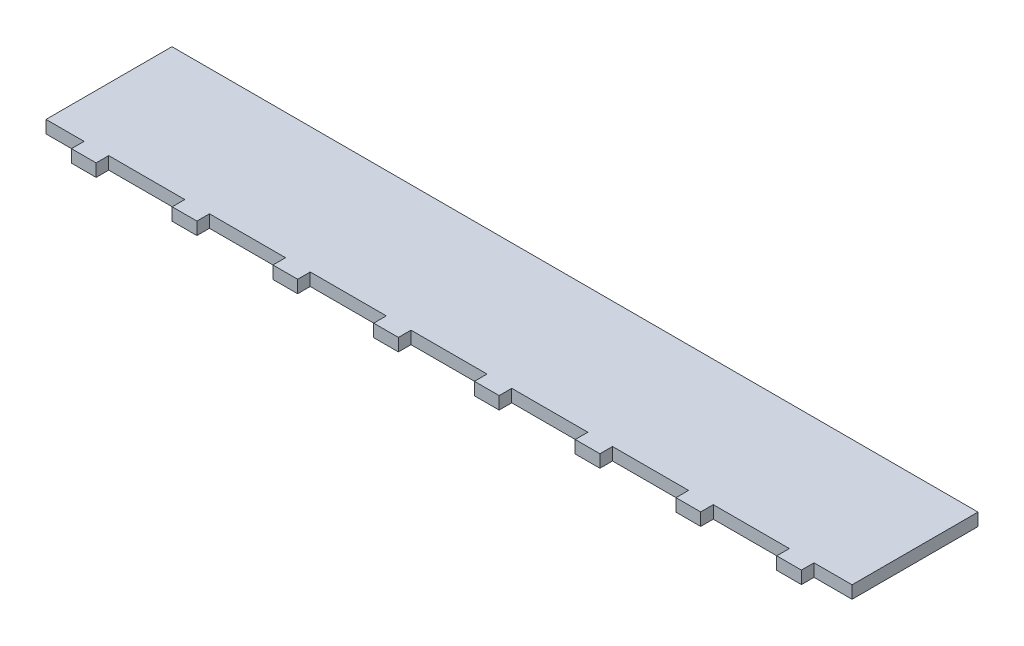
ISO-10303-21;
HEADER;
FILE_DESCRIPTION(('STEP AP214'),'2;1');
FILE_NAME('part.step','',(''),(''),'','','');
FILE_SCHEMA(('AUTOMOTIVE_DESIGN { 1 0 10303 214 1 1 1 1 }'));
ENDSEC;
DATA;
#1=APPLICATION_CONTEXT('core data for automotive mechanical design processes');
#2=APPLICATION_PROTOCOL_DEFINITION('international standard','automotive_design',2000,#1);
#3=PRODUCT_CONTEXT('',#1,'mechanical');
#4=PRODUCT('Part','Part','',(#3));
#5=PRODUCT_RELATED_PRODUCT_CATEGORY('part','',(#4));
#6=PRODUCT_DEFINITION_FORMATION('','',#4);
#7=PRODUCT_DEFINITION_CONTEXT('part definition',#1,'design');
#8=PRODUCT_DEFINITION('design','',#6,#7);
#9=PRODUCT_DEFINITION_SHAPE('','',#8);
#10=(LENGTH_UNIT() NAMED_UNIT(*) SI_UNIT(.MILLI.,.METRE.));
#11=(NAMED_UNIT(*) PLANE_ANGLE_UNIT() SI_UNIT($,.RADIAN.));
#12=(NAMED_UNIT(*) SI_UNIT($,.STERADIAN.) SOLID_ANGLE_UNIT());
#13=UNCERTAINTY_MEASURE_WITH_UNIT(LENGTH_MEASURE(1.E-05),#10,'distance_accuracy_value','');
#14=(GEOMETRIC_REPRESENTATION_CONTEXT(3) GLOBAL_UNCERTAINTY_ASSIGNED_CONTEXT((#13)) GLOBAL_UNIT_ASSIGNED_CONTEXT((#10,
#11,#12)) REPRESENTATION_CONTEXT('',''));
#15=CARTESIAN_POINT('',(0.,0.,0.));
#16=DIRECTION('',(0.,0.,1.));
#17=DIRECTION('',(1.,0.,0.));
#18=AXIS2_PLACEMENT_3D('',#15,#16,#17);
#19=CARTESIAN_POINT('',(-101.6,3.175,15.875));
#20=DIRECTION('',(0.,0.,-1.));
#21=DIRECTION('',(-1.,0.,0.));
#22=AXIS2_PLACEMENT_3D('',#19,#20,#21);
#23=PLANE('',#22);
#24=DIRECTION('',(0.,-1.,0.));
#25=VECTOR('',#24,1.);
#26=CARTESIAN_POINT('',(-92.0114999999999,3.175,15.875));
#27=LINE('',#26,#25);
#28=CARTESIAN_POINT('',(-92.0114999999999,3.175,15.875));
#29=VERTEX_POINT('',#28);
#30=CARTESIAN_POINT('',(-92.0114999999999,0.,15.875));
#31=VERTEX_POINT('',#30);
#32=EDGE_CURVE('E58',#29,#31,#27,.T.);
#33=ORIENTED_EDGE('',*,*,#32,.F.);
#34=DIRECTION('',(1.,0.,0.));
#35=VECTOR('',#34,1.);
#36=CARTESIAN_POINT('',(-101.6,3.175,15.875));
#37=LINE('',#36,#35);
#38=CARTESIAN_POINT('',(-101.6,3.175,15.875));
#39=VERTEX_POINT('',#38);
#40=EDGE_CURVE('E498',#39,#29,#37,.T.);
#41=ORIENTED_EDGE('',*,*,#40,.F.);
#42=DIRECTION('',(0.,-1.,0.));
#43=VECTOR('',#42,1.);
#44=CARTESIAN_POINT('',(-101.6,3.175,15.875));
#45=LINE('',#44,#43);
#46=CARTESIAN_POINT('',(-101.6,0.,15.875));
#47=VERTEX_POINT('',#46);
#48=EDGE_CURVE('E512',#39,#47,#45,.T.);
#49=ORIENTED_EDGE('',*,*,#48,.T.);
#50=DIRECTION('',(1.,0.,0.));
#51=VECTOR('',#50,1.);
#52=CARTESIAN_POINT('',(-101.6,0.,15.875));
#53=LINE('',#52,#51);
#54=EDGE_CURVE('E493',#47,#31,#53,.T.);
#55=ORIENTED_EDGE('',*,*,#54,.T.);
#56=EDGE_LOOP('',(#33,#41,#49,#55));
#57=FACE_BOUND('',#56,.T.);
#58=ADVANCED_FACE('F35',(#57),#23,.F.);
#59=DIRECTION('',(0.,1.,0.));
#60=VECTOR('',#59,1.);
#61=CARTESIAN_POINT('',(-85.7884999999999,3.175,15.875));
#62=LINE('',#61,#60);
#63=CARTESIAN_POINT('',(-85.7884999999999,0.,15.875));
#64=VERTEX_POINT('',#63);
#65=CARTESIAN_POINT('',(-85.7884999999999,3.175,15.875));
#66=VERTEX_POINT('',#65);
#67=EDGE_CURVE('E291',#64,#66,#62,.T.);
#68=ORIENTED_EDGE('',*,*,#67,.F.);
#69=CARTESIAN_POINT('',(-66.6114999999999,0.,15.875));
#70=VERTEX_POINT('',#69);
#71=EDGE_CURVE('E509',#64,#70,#53,.T.);
#72=ORIENTED_EDGE('',*,*,#71,.T.);
#73=DIRECTION('',(0.,-1.,0.));
#74=VECTOR('',#73,1.);
#75=CARTESIAN_POINT('',(-66.6114999999999,3.175,15.875));
#76=LINE('',#75,#74);
#77=CARTESIAN_POINT('',(-66.6114999999999,3.175,15.875));
#78=VERTEX_POINT('',#77);
#79=EDGE_CURVE('E294',#78,#70,#76,.T.);
#80=ORIENTED_EDGE('',*,*,#79,.F.);
#81=EDGE_CURVE('E50',#66,#78,#37,.T.);
#82=ORIENTED_EDGE('',*,*,#81,.F.);
#83=EDGE_LOOP('',(#68,#72,#80,#82));
#84=FACE_BOUND('',#83,.T.);
#85=ADVANCED_FACE('F538',(#84),#23,.F.);
#86=DIRECTION('',(0.,1.,0.));
#87=VECTOR('',#86,1.);
#88=CARTESIAN_POINT('',(-60.3884999999999,3.175,15.875));
#89=LINE('',#88,#87);
#90=CARTESIAN_POINT('',(-60.3884999999999,0.,15.875));
#91=VERTEX_POINT('',#90);
#92=CARTESIAN_POINT('',(-60.3884999999999,3.175,15.875));
#93=VERTEX_POINT('',#92);
#94=EDGE_CURVE('E297',#91,#93,#89,.T.);
#95=ORIENTED_EDGE('',*,*,#94,.F.);
#96=CARTESIAN_POINT('',(-41.2115,0.,15.875));
#97=VERTEX_POINT('',#96);
#98=EDGE_CURVE('E554',#91,#97,#53,.T.);
#99=ORIENTED_EDGE('',*,*,#98,.T.);
#100=DIRECTION('',(0.,-1.,0.));
#101=VECTOR('',#100,1.);
#102=CARTESIAN_POINT('',(-41.2115,3.175,15.875));
#103=LINE('',#102,#101);
#104=CARTESIAN_POINT('',(-41.2115,3.175,15.875));
#105=VERTEX_POINT('',#104);
#106=EDGE_CURVE('E326',#105,#97,#103,.T.);
#107=ORIENTED_EDGE('',*,*,#106,.F.);
#108=EDGE_CURVE('E537',#93,#105,#37,.T.);
#109=ORIENTED_EDGE('',*,*,#108,.F.);
#110=EDGE_LOOP('',(#95,#99,#107,#109));
#111=FACE_BOUND('',#110,.T.);
#112=ADVANCED_FACE('F553',(#111),#23,.F.);
#113=DIRECTION('',(0.,1.,0.));
#114=VECTOR('',#113,1.);
#115=CARTESIAN_POINT('',(-34.9885,3.175,15.875));
#116=LINE('',#115,#114);
#117=CARTESIAN_POINT('',(-34.9885,0.,15.875));
#118=VERTEX_POINT('',#117);
#119=CARTESIAN_POINT('',(-34.9885,3.175,15.875));
#120=VERTEX_POINT('',#119);
#121=EDGE_CURVE('E331',#118,#120,#116,.T.);
#122=ORIENTED_EDGE('',*,*,#121,.F.);
#123=CARTESIAN_POINT('',(-15.8115,0.,15.875));
#124=VERTEX_POINT('',#123);
#125=EDGE_CURVE('E618',#118,#124,#53,.T.);
#126=ORIENTED_EDGE('',*,*,#125,.T.);
#127=DIRECTION('',(0.,-1.,0.));
#128=VECTOR('',#127,1.);
#129=CARTESIAN_POINT('',(-15.8115,3.175,15.875));
#130=LINE('',#129,#128);
#131=CARTESIAN_POINT('',(-15.8115,3.175,15.875));
#132=VERTEX_POINT('',#131);
#133=EDGE_CURVE('E353',#132,#124,#130,.T.);
#134=ORIENTED_EDGE('',*,*,#133,.F.);
#135=EDGE_CURVE('E555',#120,#132,#37,.T.);
#136=ORIENTED_EDGE('',*,*,#135,.F.);
#137=EDGE_LOOP('',(#122,#126,#134,#136));
#138=FACE_BOUND('',#137,.T.);
#139=ADVANCED_FACE('F623',(#138),#23,.F.);
#140=DIRECTION('',(0.,1.,0.));
#141=VECTOR('',#140,1.);
#142=CARTESIAN_POINT('',(-9.58849999999996,3.175,15.875));
#143=LINE('',#142,#141);
#144=CARTESIAN_POINT('',(-9.58849999999996,0.,15.875));
#145=VERTEX_POINT('',#144);
#146=CARTESIAN_POINT('',(-9.58849999999996,3.175,15.875));
#147=VERTEX_POINT('',#146);
#148=EDGE_CURVE('E358',#145,#147,#143,.T.);
#149=ORIENTED_EDGE('',*,*,#148,.F.);
#150=CARTESIAN_POINT('',(9.58850000000005,0.,15.875));
#151=VERTEX_POINT('',#150);
#152=EDGE_CURVE('E615',#145,#151,#53,.T.);
#153=ORIENTED_EDGE('',*,*,#152,.T.);
#154=DIRECTION('',(0.,-1.,0.));
#155=VECTOR('',#154,1.);
#156=CARTESIAN_POINT('',(9.58850000000005,3.175,15.875));
#157=LINE('',#156,#155);
#158=CARTESIAN_POINT('',(9.58850000000005,3.175,15.875));
#159=VERTEX_POINT('',#158);
#160=EDGE_CURVE('E380',#159,#151,#157,.T.);
#161=ORIENTED_EDGE('',*,*,#160,.F.);
#162=EDGE_CURVE('E556',#147,#159,#37,.T.);
#163=ORIENTED_EDGE('',*,*,#162,.F.);
#164=EDGE_LOOP('',(#149,#153,#161,#163));
#165=FACE_BOUND('',#164,.T.);
#166=ADVANCED_FACE('F637',(#165),#23,.F.);
#167=DIRECTION('',(0.,1.,0.));
#168=VECTOR('',#167,1.);
#169=CARTESIAN_POINT('',(15.8115,3.175,15.875));
#170=LINE('',#169,#168);
#171=CARTESIAN_POINT('',(15.8115,0.,15.875));
#172=VERTEX_POINT('',#171);
#173=CARTESIAN_POINT('',(15.8115,3.175,15.875));
#174=VERTEX_POINT('',#173);
#175=EDGE_CURVE('E385',#172,#174,#170,.T.);
#176=ORIENTED_EDGE('',*,*,#175,.F.);
#177=CARTESIAN_POINT('',(34.9885,0.,15.875));
#178=VERTEX_POINT('',#177);
#179=EDGE_CURVE('E613',#172,#178,#53,.T.);
#180=ORIENTED_EDGE('',*,*,#179,.T.);
#181=DIRECTION('',(0.,-1.,0.));
#182=VECTOR('',#181,1.);
#183=CARTESIAN_POINT('',(34.9885,3.175,15.875));
#184=LINE('',#183,#182);
#185=CARTESIAN_POINT('',(34.9885,3.175,15.875));
#186=VERTEX_POINT('',#185);
#187=EDGE_CURVE('E407',#186,#178,#184,.T.);
#188=ORIENTED_EDGE('',*,*,#187,.F.);
#189=EDGE_CURVE('E559',#174,#186,#37,.T.);
#190=ORIENTED_EDGE('',*,*,#189,.F.);
#191=EDGE_LOOP('',(#176,#180,#188,#190));
#192=FACE_BOUND('',#191,.T.);
#193=ADVANCED_FACE('F602',(#192),#23,.F.);
#194=DIRECTION('',(0.,1.,0.));
#195=VECTOR('',#194,1.);
#196=CARTESIAN_POINT('',(41.2115,3.175,15.875));
#197=LINE('',#196,#195);
#198=CARTESIAN_POINT('',(41.2115,0.,15.875));
#199=VERTEX_POINT('',#198);
#200=CARTESIAN_POINT('',(41.2115,3.175,15.875));
#201=VERTEX_POINT('',#200);
#202=EDGE_CURVE('E412',#199,#201,#197,.T.);
#203=ORIENTED_EDGE('',*,*,#202,.F.);
#204=CARTESIAN_POINT('',(60.3885000000001,0.,15.875));
#205=VERTEX_POINT('',#204);
#206=EDGE_CURVE('E612',#199,#205,#53,.T.);
#207=ORIENTED_EDGE('',*,*,#206,.T.);
#208=DIRECTION('',(0.,-1.,0.));
#209=VECTOR('',#208,1.);
#210=CARTESIAN_POINT('',(60.3885,3.175,15.875));
#211=LINE('',#210,#209);
#212=CARTESIAN_POINT('',(60.3885000000001,3.175,15.875));
#213=VERTEX_POINT('',#212);
#214=EDGE_CURVE('E434',#213,#205,#211,.T.);
#215=ORIENTED_EDGE('',*,*,#214,.F.);
#216=EDGE_CURVE('E562',#201,#213,#37,.T.);
#217=ORIENTED_EDGE('',*,*,#216,.F.);
#218=EDGE_LOOP('',(#203,#207,#215,#217));
#219=FACE_BOUND('',#218,.T.);
#220=ADVANCED_FACE('F597',(#219),#23,.F.);
#221=DIRECTION('',(0.,1.,0.));
#222=VECTOR('',#221,1.);
#223=CARTESIAN_POINT('',(66.6115,3.175,15.875));
#224=LINE('',#223,#222);
#225=CARTESIAN_POINT('',(66.6115,0.,15.875));
#226=VERTEX_POINT('',#225);
#227=CARTESIAN_POINT('',(66.6115000000001,3.175,15.875));
#228=VERTEX_POINT('',#227);
#229=EDGE_CURVE('E439',#226,#228,#224,.T.);
#230=ORIENTED_EDGE('',*,*,#229,.F.);
#231=CARTESIAN_POINT('',(85.7885000000001,0.,15.875));
#232=VERTEX_POINT('',#231);
#233=EDGE_CURVE('E605',#226,#232,#53,.T.);
#234=ORIENTED_EDGE('',*,*,#233,.T.);
#235=DIRECTION('',(0.,-1.,0.));
#236=VECTOR('',#235,1.);
#237=CARTESIAN_POINT('',(85.7885,3.175,15.875));
#238=LINE('',#237,#236);
#239=CARTESIAN_POINT('',(85.7885000000001,3.175,15.875));
#240=VERTEX_POINT('',#239);
#241=EDGE_CURVE('E461',#240,#232,#238,.T.);
#242=ORIENTED_EDGE('',*,*,#241,.F.);
#243=EDGE_CURVE('E565',#228,#240,#37,.T.);
#244=ORIENTED_EDGE('',*,*,#243,.F.);
#245=EDGE_LOOP('',(#230,#234,#242,#244));
#246=FACE_BOUND('',#245,.T.);
#247=ADVANCED_FACE('F593',(#246),#23,.F.);
#248=DIRECTION('',(0.,1.,0.));
#249=VECTOR('',#248,1.);
#250=CARTESIAN_POINT('',(92.0115,3.175,15.875));
#251=LINE('',#250,#249);
#252=CARTESIAN_POINT('',(92.0115,0.,15.875));
#253=VERTEX_POINT('',#252);
#254=CARTESIAN_POINT('',(92.0115,3.175,15.875));
#255=VERTEX_POINT('',#254);
#256=EDGE_CURVE('E466',#253,#255,#251,.T.);
#257=ORIENTED_EDGE('',*,*,#256,.F.);
#258=CARTESIAN_POINT('',(101.6,0.,15.875));
#259=VERTEX_POINT('',#258);
#260=EDGE_CURVE('E507',#253,#259,#53,.T.);
#261=ORIENTED_EDGE('',*,*,#260,.T.);
#262=DIRECTION('',(0.,-1.,0.));
#263=VECTOR('',#262,1.);
#264=CARTESIAN_POINT('',(101.6,3.175,15.875));
#265=LINE('',#264,#263);
#266=CARTESIAN_POINT('',(101.6,3.175,15.875));
#267=VERTEX_POINT('',#266);
#268=EDGE_CURVE('E500',#267,#259,#265,.T.);
#269=ORIENTED_EDGE('',*,*,#268,.F.);
#270=EDGE_CURVE('E497',#255,#267,#37,.T.);
#271=ORIENTED_EDGE('',*,*,#270,.F.);
#272=EDGE_LOOP('',(#257,#261,#269,#271));
#273=FACE_BOUND('',#272,.T.);
#274=ADVANCED_FACE('F576',(#273),#23,.F.);
#275=CARTESIAN_POINT('',(101.6,3.175,-15.875));
#276=DIRECTION('',(-1.,0.,0.));
#277=DIRECTION('',(0.,0.,1.));
#278=AXIS2_PLACEMENT_3D('',#275,#276,#277);
#279=PLANE('',#278);
#280=DIRECTION('',(0.,0.,-1.));
#281=VECTOR('',#280,1.);
#282=CARTESIAN_POINT('',(101.6,0.,-15.875));
#283=LINE('',#282,#281);
#284=CARTESIAN_POINT('',(101.6,0.,-15.875));
#285=VERTEX_POINT('',#284);
#286=EDGE_CURVE('E488',#259,#285,#283,.T.);
#287=ORIENTED_EDGE('',*,*,#286,.T.);
#288=DIRECTION('',(0.,-1.,0.));
#289=VECTOR('',#288,1.);
#290=CARTESIAN_POINT('',(101.6,3.175,-15.875));
#291=LINE('',#290,#289);
#292=CARTESIAN_POINT('',(101.6,3.175,-15.875));
#293=VERTEX_POINT('',#292);
#294=EDGE_CURVE('E11',#293,#285,#291,.T.);
#295=ORIENTED_EDGE('',*,*,#294,.F.);
#296=DIRECTION('',(0.,0.,-1.));
#297=VECTOR('',#296,1.);
#298=CARTESIAN_POINT('',(101.6,3.175,-15.875));
#299=LINE('',#298,#297);
#300=EDGE_CURVE('E489',#267,#293,#299,.T.);
#301=ORIENTED_EDGE('',*,*,#300,.F.);
#302=ORIENTED_EDGE('',*,*,#268,.T.);
#303=EDGE_LOOP('',(#287,#295,#301,#302));
#304=FACE_BOUND('',#303,.T.);
#305=ADVANCED_FACE('F37',(#304),#279,.F.);
#306=CARTESIAN_POINT('',(-101.6,3.175,-15.875));
#307=DIRECTION('',(0.,0.,1.));
#308=DIRECTION('',(1.,0.,0.));
#309=AXIS2_PLACEMENT_3D('',#306,#307,#308);
#310=PLANE('',#309);
#311=DIRECTION('',(-1.,0.,0.));
#312=VECTOR('',#311,1.);
#313=CARTESIAN_POINT('',(-101.6,0.,-15.875));
#314=LINE('',#313,#312);
#315=CARTESIAN_POINT('',(-101.6,0.,-15.875));
#316=VERTEX_POINT('',#315);
#317=EDGE_CURVE('E503',#285,#316,#314,.T.);
#318=ORIENTED_EDGE('',*,*,#317,.T.);
#319=DIRECTION('',(0.,-1.,0.));
#320=VECTOR('',#319,1.);
#321=CARTESIAN_POINT('',(-101.6,3.175,-15.875));
#322=LINE('',#321,#320);
#323=CARTESIAN_POINT('',(-101.6,3.175,-15.875));
#324=VERTEX_POINT('',#323);
#325=EDGE_CURVE('E43',#324,#316,#322,.T.);
#326=ORIENTED_EDGE('',*,*,#325,.F.);
#327=DIRECTION('',(-1.,0.,0.));
#328=VECTOR('',#327,1.);
#329=CARTESIAN_POINT('',(-101.6,3.175,-15.875));
#330=LINE('',#329,#328);
#331=EDGE_CURVE('E492',#293,#324,#330,.T.);
#332=ORIENTED_EDGE('',*,*,#331,.F.);
#333=ORIENTED_EDGE('',*,*,#294,.T.);
#334=EDGE_LOOP('',(#318,#326,#332,#333));
#335=FACE_BOUND('',#334,.T.);
#336=ADVANCED_FACE('F579',(#335),#310,.F.);
#337=CARTESIAN_POINT('',(-101.6,3.175,-15.875));
#338=DIRECTION('',(1.,0.,0.));
#339=DIRECTION('',(0.,0.,-1.));
#340=AXIS2_PLACEMENT_3D('',#337,#338,#339);
#341=PLANE('',#340);
#342=DIRECTION('',(0.,0.,1.));
#343=VECTOR('',#342,1.);
#344=CARTESIAN_POINT('',(-101.6,0.,-15.875));
#345=LINE('',#344,#343);
#346=EDGE_CURVE('E505',#316,#47,#345,.T.);
#347=ORIENTED_EDGE('',*,*,#346,.T.);
#348=ORIENTED_EDGE('',*,*,#48,.F.);
#349=DIRECTION('',(0.,0.,1.));
#350=VECTOR('',#349,1.);
#351=CARTESIAN_POINT('',(-101.6,3.175,-15.875));
#352=LINE('',#351,#350);
#353=EDGE_CURVE('E495',#324,#39,#352,.T.);
#354=ORIENTED_EDGE('',*,*,#353,.F.);
#355=ORIENTED_EDGE('',*,*,#325,.T.);
#356=EDGE_LOOP('',(#347,#348,#354,#355));
#357=FACE_BOUND('',#356,.T.);
#358=ADVANCED_FACE('F519',(#357),#341,.F.);
#359=CARTESIAN_POINT('',(0.,3.175,0.));
#360=DIRECTION('',(0.,1.,0.));
#361=DIRECTION('',(0.,0.,1.));
#362=AXIS2_PLACEMENT_3D('',#359,#360,#361);
#363=PLANE('',#362);
#364=ORIENTED_EDGE('',*,*,#300,.T.);
#365=ORIENTED_EDGE('',*,*,#331,.T.);
#366=ORIENTED_EDGE('',*,*,#353,.T.);
#367=ORIENTED_EDGE('',*,*,#40,.T.);
#368=DIRECTION('',(0.,0.,-1.));
#369=VECTOR('',#368,1.);
#370=CARTESIAN_POINT('',(-92.0114999999999,3.175,19.05));
#371=LINE('',#370,#369);
#372=CARTESIAN_POINT('',(-92.0114999999999,3.175,19.05));
#373=VERTEX_POINT('',#372);
#374=EDGE_CURVE('E524',#373,#29,#371,.T.);
#375=ORIENTED_EDGE('',*,*,#374,.F.);
#376=DIRECTION('',(-1.,0.,0.));
#377=VECTOR('',#376,1.);
#378=CARTESIAN_POINT('',(-92.0114999999999,3.175,19.05));
#379=LINE('',#378,#377);
#380=CARTESIAN_POINT('',(-85.7884999999999,3.175,19.05));
#381=VERTEX_POINT('',#380);
#382=EDGE_CURVE('E287',#381,#373,#379,.T.);
#383=ORIENTED_EDGE('',*,*,#382,.F.);
#384=DIRECTION('',(0.,0.,-1.));
#385=VECTOR('',#384,1.);
#386=CARTESIAN_POINT('',(-85.7884999999999,3.175,19.05));
#387=LINE('',#386,#385);
#388=EDGE_CURVE('E299',#381,#66,#387,.T.);
#389=ORIENTED_EDGE('',*,*,#388,.T.);
#390=ORIENTED_EDGE('',*,*,#81,.T.);
#391=DIRECTION('',(0.,0.,-1.));
#392=VECTOR('',#391,1.);
#393=CARTESIAN_POINT('',(-66.6114999999999,3.175,19.05));
#394=LINE('',#393,#392);
#395=CARTESIAN_POINT('',(-66.6114999999999,3.175,19.05));
#396=VERTEX_POINT('',#395);
#397=EDGE_CURVE('E311',#396,#78,#394,.T.);
#398=ORIENTED_EDGE('',*,*,#397,.F.);
#399=DIRECTION('',(-1.,0.,0.));
#400=VECTOR('',#399,1.);
#401=CARTESIAN_POINT('',(-66.6114999999999,3.175,19.05));
#402=LINE('',#401,#400);
#403=CARTESIAN_POINT('',(-60.3884999999999,3.175,19.05));
#404=VERTEX_POINT('',#403);
#405=EDGE_CURVE('E310',#404,#396,#402,.T.);
#406=ORIENTED_EDGE('',*,*,#405,.F.);
#407=DIRECTION('',(0.,0.,-1.));
#408=VECTOR('',#407,1.);
#409=CARTESIAN_POINT('',(-60.3884999999999,3.175,19.05));
#410=LINE('',#409,#408);
#411=EDGE_CURVE('E317',#404,#93,#410,.T.);
#412=ORIENTED_EDGE('',*,*,#411,.T.);
#413=ORIENTED_EDGE('',*,*,#108,.T.);
#414=DIRECTION('',(0.,0.,-1.));
#415=VECTOR('',#414,1.);
#416=CARTESIAN_POINT('',(-41.2115,3.175,19.05));
#417=LINE('',#416,#415);
#418=CARTESIAN_POINT('',(-41.2115,3.175,19.05));
#419=VERTEX_POINT('',#418);
#420=EDGE_CURVE('E337',#419,#105,#417,.T.);
#421=ORIENTED_EDGE('',*,*,#420,.F.);
#422=DIRECTION('',(-1.,0.,0.));
#423=VECTOR('',#422,1.);
#424=CARTESIAN_POINT('',(-41.2115,3.175,19.05));
#425=LINE('',#424,#423);
#426=CARTESIAN_POINT('',(-34.9885,3.175,19.05));
#427=VERTEX_POINT('',#426);
#428=EDGE_CURVE('E335',#427,#419,#425,.T.);
#429=ORIENTED_EDGE('',*,*,#428,.F.);
#430=DIRECTION('',(0.,0.,-1.));
#431=VECTOR('',#430,1.);
#432=CARTESIAN_POINT('',(-34.9885,3.175,19.05));
#433=LINE('',#432,#431);
#434=EDGE_CURVE('E344',#427,#120,#433,.T.);
#435=ORIENTED_EDGE('',*,*,#434,.T.);
#436=ORIENTED_EDGE('',*,*,#135,.T.);
#437=DIRECTION('',(0.,0.,-1.));
#438=VECTOR('',#437,1.);
#439=CARTESIAN_POINT('',(-15.8115,3.175,19.05));
#440=LINE('',#439,#438);
#441=CARTESIAN_POINT('',(-15.8115,3.175,19.05));
#442=VERTEX_POINT('',#441);
#443=EDGE_CURVE('E364',#442,#132,#440,.T.);
#444=ORIENTED_EDGE('',*,*,#443,.F.);
#445=DIRECTION('',(-1.,0.,0.));
#446=VECTOR('',#445,1.);
#447=CARTESIAN_POINT('',(-15.8115,3.175,19.05));
#448=LINE('',#447,#446);
#449=CARTESIAN_POINT('',(-9.58849999999996,3.175,19.05));
#450=VERTEX_POINT('',#449);
#451=EDGE_CURVE('E362',#450,#442,#448,.T.);
#452=ORIENTED_EDGE('',*,*,#451,.F.);
#453=DIRECTION('',(0.,0.,-1.));
#454=VECTOR('',#453,1.);
#455=CARTESIAN_POINT('',(-9.58849999999996,3.175,19.05));
#456=LINE('',#455,#454);
#457=EDGE_CURVE('E371',#450,#147,#456,.T.);
#458=ORIENTED_EDGE('',*,*,#457,.T.);
#459=ORIENTED_EDGE('',*,*,#162,.T.);
#460=DIRECTION('',(0.,0.,-1.));
#461=VECTOR('',#460,1.);
#462=CARTESIAN_POINT('',(9.58850000000005,3.175,19.05));
#463=LINE('',#462,#461);
#464=CARTESIAN_POINT('',(9.58850000000005,3.175,19.05));
#465=VERTEX_POINT('',#464);
#466=EDGE_CURVE('E391',#465,#159,#463,.T.);
#467=ORIENTED_EDGE('',*,*,#466,.F.);
#468=DIRECTION('',(-1.,0.,0.));
#469=VECTOR('',#468,1.);
#470=CARTESIAN_POINT('',(9.58850000000005,3.175,19.05));
#471=LINE('',#470,#469);
#472=CARTESIAN_POINT('',(15.8115,3.175,19.05));
#473=VERTEX_POINT('',#472);
#474=EDGE_CURVE('E389',#473,#465,#471,.T.);
#475=ORIENTED_EDGE('',*,*,#474,.F.);
#476=DIRECTION('',(0.,0.,-1.));
#477=VECTOR('',#476,1.);
#478=CARTESIAN_POINT('',(15.8115,3.175,19.05));
#479=LINE('',#478,#477);
#480=EDGE_CURVE('E398',#473,#174,#479,.T.);
#481=ORIENTED_EDGE('',*,*,#480,.T.);
#482=ORIENTED_EDGE('',*,*,#189,.T.);
#483=DIRECTION('',(0.,0.,-1.));
#484=VECTOR('',#483,1.);
#485=CARTESIAN_POINT('',(34.9885,3.175,19.05));
#486=LINE('',#485,#484);
#487=CARTESIAN_POINT('',(34.9885,3.175,19.05));
#488=VERTEX_POINT('',#487);
#489=EDGE_CURVE('E418',#488,#186,#486,.T.);
#490=ORIENTED_EDGE('',*,*,#489,.F.);
#491=DIRECTION('',(-1.,0.,0.));
#492=VECTOR('',#491,1.);
#493=CARTESIAN_POINT('',(34.9885,3.175,19.05));
#494=LINE('',#493,#492);
#495=CARTESIAN_POINT('',(41.2115,3.175,19.05));
#496=VERTEX_POINT('',#495);
#497=EDGE_CURVE('E416',#496,#488,#494,.T.);
#498=ORIENTED_EDGE('',*,*,#497,.F.);
#499=DIRECTION('',(0.,0.,-1.));
#500=VECTOR('',#499,1.);
#501=CARTESIAN_POINT('',(41.2115,3.175,19.05));
#502=LINE('',#501,#500);
#503=EDGE_CURVE('E425',#496,#201,#502,.T.);
#504=ORIENTED_EDGE('',*,*,#503,.T.);
#505=ORIENTED_EDGE('',*,*,#216,.T.);
#506=DIRECTION('',(0.,0.,-1.));
#507=VECTOR('',#506,1.);
#508=CARTESIAN_POINT('',(60.3885,3.175,19.05));
#509=LINE('',#508,#507);
#510=CARTESIAN_POINT('',(60.3885,3.175,19.05));
#511=VERTEX_POINT('',#510);
#512=EDGE_CURVE('E445',#511,#213,#509,.T.);
#513=ORIENTED_EDGE('',*,*,#512,.F.);
#514=DIRECTION('',(-1.,0.,0.));
#515=VECTOR('',#514,1.);
#516=CARTESIAN_POINT('',(60.3885,3.175,19.05));
#517=LINE('',#516,#515);
#518=CARTESIAN_POINT('',(66.6115,3.175,19.05));
#519=VERTEX_POINT('',#518);
#520=EDGE_CURVE('E443',#519,#511,#517,.T.);
#521=ORIENTED_EDGE('',*,*,#520,.F.);
#522=DIRECTION('',(0.,0.,-1.));
#523=VECTOR('',#522,1.);
#524=CARTESIAN_POINT('',(66.6115,3.175,19.05));
#525=LINE('',#524,#523);
#526=EDGE_CURVE('E452',#519,#228,#525,.T.);
#527=ORIENTED_EDGE('',*,*,#526,.T.);
#528=ORIENTED_EDGE('',*,*,#243,.T.);
#529=DIRECTION('',(0.,0.,-1.));
#530=VECTOR('',#529,1.);
#531=CARTESIAN_POINT('',(85.7885,3.175,19.05));
#532=LINE('',#531,#530);
#533=CARTESIAN_POINT('',(85.7885,3.175,19.05));
#534=VERTEX_POINT('',#533);
#535=EDGE_CURVE('E472',#534,#240,#532,.T.);
#536=ORIENTED_EDGE('',*,*,#535,.F.);
#537=DIRECTION('',(-1.,0.,0.));
#538=VECTOR('',#537,1.);
#539=CARTESIAN_POINT('',(85.7885,3.175,19.05));
#540=LINE('',#539,#538);
#541=CARTESIAN_POINT('',(92.0115,3.175,19.05));
#542=VERTEX_POINT('',#541);
#543=EDGE_CURVE('E470',#542,#534,#540,.T.);
#544=ORIENTED_EDGE('',*,*,#543,.F.);
#545=DIRECTION('',(0.,0.,-1.));
#546=VECTOR('',#545,1.);
#547=CARTESIAN_POINT('',(92.0115,3.175,19.05));
#548=LINE('',#547,#546);
#549=EDGE_CURVE('E479',#542,#255,#548,.T.);
#550=ORIENTED_EDGE('',*,*,#549,.T.);
#551=ORIENTED_EDGE('',*,*,#270,.T.);
#552=EDGE_LOOP('',(#364,#365,#366,#367,#375,#383,#389,#390,#398,#406,#412,#413,#421,#429,#435,
#436,#444,#452,#458,#459,#467,#475,#481,#482,#490,#498,#504,#505,#513,#521,#527,#528,#536,#544,
#550,#551));
#553=FACE_BOUND('',#552,.T.);
#554=ADVANCED_FACE('F523',(#553),#363,.T.);
#555=CARTESIAN_POINT('',(0.,0.,0.));
#556=DIRECTION('',(0.,1.,0.));
#557=DIRECTION('',(0.,0.,1.));
#558=AXIS2_PLACEMENT_3D('',#555,#556,#557);
#559=PLANE('',#558);
#560=ORIENTED_EDGE('',*,*,#286,.F.);
#561=ORIENTED_EDGE('',*,*,#260,.F.);
#562=DIRECTION('',(0.,0.,-1.));
#563=VECTOR('',#562,1.);
#564=CARTESIAN_POINT('',(92.0115,0.,19.05));
#565=LINE('',#564,#563);
#566=CARTESIAN_POINT('',(92.0115,0.,19.05));
#567=VERTEX_POINT('',#566);
#568=EDGE_CURVE('E482',#567,#253,#565,.T.);
#569=ORIENTED_EDGE('',*,*,#568,.F.);
#570=DIRECTION('',(1.,0.,0.));
#571=VECTOR('',#570,1.);
#572=CARTESIAN_POINT('',(85.7885,0.,19.05));
#573=LINE('',#572,#571);
#574=CARTESIAN_POINT('',(85.7885,0.,19.05));
#575=VERTEX_POINT('',#574);
#576=EDGE_CURVE('E465',#575,#567,#573,.T.);
#577=ORIENTED_EDGE('',*,*,#576,.F.);
#578=DIRECTION('',(0.,0.,-1.));
#579=VECTOR('',#578,1.);
#580=CARTESIAN_POINT('',(85.7885,0.,19.05));
#581=LINE('',#580,#579);
#582=EDGE_CURVE('E485',#575,#232,#581,.T.);
#583=ORIENTED_EDGE('',*,*,#582,.T.);
#584=ORIENTED_EDGE('',*,*,#233,.F.);
#585=DIRECTION('',(0.,0.,-1.));
#586=VECTOR('',#585,1.);
#587=CARTESIAN_POINT('',(66.6115,0.,19.05));
#588=LINE('',#587,#586);
#589=CARTESIAN_POINT('',(66.6115,0.,19.05));
#590=VERTEX_POINT('',#589);
#591=EDGE_CURVE('E455',#590,#226,#588,.T.);
#592=ORIENTED_EDGE('',*,*,#591,.F.);
#593=DIRECTION('',(1.,0.,0.));
#594=VECTOR('',#593,1.);
#595=CARTESIAN_POINT('',(60.3885,0.,19.05));
#596=LINE('',#595,#594);
#597=CARTESIAN_POINT('',(60.3885,0.,19.05));
#598=VERTEX_POINT('',#597);
#599=EDGE_CURVE('E438',#598,#590,#596,.T.);
#600=ORIENTED_EDGE('',*,*,#599,.F.);
#601=DIRECTION('',(0.,0.,-1.));
#602=VECTOR('',#601,1.);
#603=CARTESIAN_POINT('',(60.3885,0.,19.05));
#604=LINE('',#603,#602);
#605=EDGE_CURVE('E458',#598,#205,#604,.T.);
#606=ORIENTED_EDGE('',*,*,#605,.T.);
#607=ORIENTED_EDGE('',*,*,#206,.F.);
#608=DIRECTION('',(0.,0.,-1.));
#609=VECTOR('',#608,1.);
#610=CARTESIAN_POINT('',(41.2115,0.,19.05));
#611=LINE('',#610,#609);
#612=CARTESIAN_POINT('',(41.2115,0.,19.05));
#613=VERTEX_POINT('',#612);
#614=EDGE_CURVE('E428',#613,#199,#611,.T.);
#615=ORIENTED_EDGE('',*,*,#614,.F.);
#616=DIRECTION('',(1.,0.,0.));
#617=VECTOR('',#616,1.);
#618=CARTESIAN_POINT('',(34.9885,0.,19.05));
#619=LINE('',#618,#617);
#620=CARTESIAN_POINT('',(34.9885,0.,19.05));
#621=VERTEX_POINT('',#620);
#622=EDGE_CURVE('E411',#621,#613,#619,.T.);
#623=ORIENTED_EDGE('',*,*,#622,.F.);
#624=DIRECTION('',(0.,0.,-1.));
#625=VECTOR('',#624,1.);
#626=CARTESIAN_POINT('',(34.9885,0.,19.05));
#627=LINE('',#626,#625);
#628=EDGE_CURVE('E431',#621,#178,#627,.T.);
#629=ORIENTED_EDGE('',*,*,#628,.T.);
#630=ORIENTED_EDGE('',*,*,#179,.F.);
#631=DIRECTION('',(0.,0.,-1.));
#632=VECTOR('',#631,1.);
#633=CARTESIAN_POINT('',(15.8115,0.,19.05));
#634=LINE('',#633,#632);
#635=CARTESIAN_POINT('',(15.8115,0.,19.05));
#636=VERTEX_POINT('',#635);
#637=EDGE_CURVE('E401',#636,#172,#634,.T.);
#638=ORIENTED_EDGE('',*,*,#637,.F.);
#639=DIRECTION('',(1.,0.,0.));
#640=VECTOR('',#639,1.);
#641=CARTESIAN_POINT('',(9.58850000000005,0.,19.05));
#642=LINE('',#641,#640);
#643=CARTESIAN_POINT('',(9.58850000000005,0.,19.05));
#644=VERTEX_POINT('',#643);
#645=EDGE_CURVE('E384',#644,#636,#642,.T.);
#646=ORIENTED_EDGE('',*,*,#645,.F.);
#647=DIRECTION('',(0.,0.,-1.));
#648=VECTOR('',#647,1.);
#649=CARTESIAN_POINT('',(9.58850000000005,0.,19.05));
#650=LINE('',#649,#648);
#651=EDGE_CURVE('E404',#644,#151,#650,.T.);
#652=ORIENTED_EDGE('',*,*,#651,.T.);
#653=ORIENTED_EDGE('',*,*,#152,.F.);
#654=DIRECTION('',(0.,0.,-1.));
#655=VECTOR('',#654,1.);
#656=CARTESIAN_POINT('',(-9.58849999999996,0.,19.05));
#657=LINE('',#656,#655);
#658=CARTESIAN_POINT('',(-9.58849999999996,0.,19.05));
#659=VERTEX_POINT('',#658);
#660=EDGE_CURVE('E374',#659,#145,#657,.T.);
#661=ORIENTED_EDGE('',*,*,#660,.F.);
#662=DIRECTION('',(1.,0.,0.));
#663=VECTOR('',#662,1.);
#664=CARTESIAN_POINT('',(-15.8115,0.,19.05));
#665=LINE('',#664,#663);
#666=CARTESIAN_POINT('',(-15.8115,0.,19.05));
#667=VERTEX_POINT('',#666);
#668=EDGE_CURVE('E357',#667,#659,#665,.T.);
#669=ORIENTED_EDGE('',*,*,#668,.F.);
#670=DIRECTION('',(0.,0.,-1.));
#671=VECTOR('',#670,1.);
#672=CARTESIAN_POINT('',(-15.8115,0.,19.05));
#673=LINE('',#672,#671);
#674=EDGE_CURVE('E377',#667,#124,#673,.T.);
#675=ORIENTED_EDGE('',*,*,#674,.T.);
#676=ORIENTED_EDGE('',*,*,#125,.F.);
#677=DIRECTION('',(0.,0.,-1.));
#678=VECTOR('',#677,1.);
#679=CARTESIAN_POINT('',(-34.9885,0.,19.05));
#680=LINE('',#679,#678);
#681=CARTESIAN_POINT('',(-34.9885,0.,19.05));
#682=VERTEX_POINT('',#681);
#683=EDGE_CURVE('E347',#682,#118,#680,.T.);
#684=ORIENTED_EDGE('',*,*,#683,.F.);
#685=DIRECTION('',(1.,0.,0.));
#686=VECTOR('',#685,1.);
#687=CARTESIAN_POINT('',(-41.2115,0.,19.05));
#688=LINE('',#687,#686);
#689=CARTESIAN_POINT('',(-41.2115,0.,19.05));
#690=VERTEX_POINT('',#689);
#691=EDGE_CURVE('E330',#690,#682,#688,.T.);
#692=ORIENTED_EDGE('',*,*,#691,.F.);
#693=DIRECTION('',(0.,0.,-1.));
#694=VECTOR('',#693,1.);
#695=CARTESIAN_POINT('',(-41.2115,0.,19.05));
#696=LINE('',#695,#694);
#697=EDGE_CURVE('E350',#690,#97,#696,.T.);
#698=ORIENTED_EDGE('',*,*,#697,.T.);
#699=ORIENTED_EDGE('',*,*,#98,.F.);
#700=DIRECTION('',(0.,0.,-1.));
#701=VECTOR('',#700,1.);
#702=CARTESIAN_POINT('',(-60.3884999999999,0.,19.05));
#703=LINE('',#702,#701);
#704=CARTESIAN_POINT('',(-60.3884999999999,0.,19.05));
#705=VERTEX_POINT('',#704);
#706=EDGE_CURVE('E320',#705,#91,#703,.T.);
#707=ORIENTED_EDGE('',*,*,#706,.F.);
#708=DIRECTION('',(1.,0.,0.));
#709=VECTOR('',#708,1.);
#710=CARTESIAN_POINT('',(-66.6114999999999,0.,19.05));
#711=LINE('',#710,#709);
#712=CARTESIAN_POINT('',(-66.6114999999999,0.,19.05));
#713=VERTEX_POINT('',#712);
#714=EDGE_CURVE('E306',#713,#705,#711,.T.);
#715=ORIENTED_EDGE('',*,*,#714,.F.);
#716=DIRECTION('',(0.,0.,-1.));
#717=VECTOR('',#716,1.);
#718=CARTESIAN_POINT('',(-66.6114999999999,0.,19.05));
#719=LINE('',#718,#717);
#720=EDGE_CURVE('E323',#713,#70,#719,.T.);
#721=ORIENTED_EDGE('',*,*,#720,.T.);
#722=ORIENTED_EDGE('',*,*,#71,.F.);
#723=DIRECTION('',(0.,0.,-1.));
#724=VECTOR('',#723,1.);
#725=CARTESIAN_POINT('',(-85.7884999999999,0.,19.05));
#726=LINE('',#725,#724);
#727=CARTESIAN_POINT('',(-85.7884999999999,0.,19.05));
#728=VERTEX_POINT('',#727);
#729=EDGE_CURVE('E278',#728,#64,#726,.T.);
#730=ORIENTED_EDGE('',*,*,#729,.F.);
#731=DIRECTION('',(1.,0.,0.));
#732=VECTOR('',#731,1.);
#733=CARTESIAN_POINT('',(-92.0114999999999,0.,19.05));
#734=LINE('',#733,#732);
#735=CARTESIAN_POINT('',(-92.0114999999999,0.,19.05));
#736=VERTEX_POINT('',#735);
#737=EDGE_CURVE('E270',#736,#728,#734,.T.);
#738=ORIENTED_EDGE('',*,*,#737,.F.);
#739=DIRECTION('',(0.,0.,-1.));
#740=VECTOR('',#739,1.);
#741=CARTESIAN_POINT('',(-92.0114999999999,0.,19.05));
#742=LINE('',#741,#740);
#743=EDGE_CURVE('E276',#736,#31,#742,.T.);
#744=ORIENTED_EDGE('',*,*,#743,.T.);
#745=ORIENTED_EDGE('',*,*,#54,.F.);
#746=ORIENTED_EDGE('',*,*,#346,.F.);
#747=ORIENTED_EDGE('',*,*,#317,.F.);
#748=EDGE_LOOP('',(#560,#561,#569,#577,#583,#584,#592,#600,#606,#607,#615,#623,#629,#630,#638,
#646,#652,#653,#661,#669,#675,#676,#684,#692,#698,#699,#707,#715,#721,#722,#730,#738,#744,#745,
#746,#747));
#749=FACE_BOUND('',#748,.T.);
#750=ADVANCED_FACE('F273',(#749),#559,.F.);
#751=CARTESIAN_POINT('',(85.7885,3.175,19.05));
#752=DIRECTION('',(1.,0.,0.));
#753=DIRECTION('',(0.,0.,-1.));
#754=AXIS2_PLACEMENT_3D('',#751,#752,#753);
#755=PLANE('',#754);
#756=ORIENTED_EDGE('',*,*,#241,.T.);
#757=ORIENTED_EDGE('',*,*,#582,.F.);
#758=DIRECTION('',(0.,-1.,0.));
#759=VECTOR('',#758,1.);
#760=CARTESIAN_POINT('',(85.7885,3.175,19.05));
#761=LINE('',#760,#759);
#762=EDGE_CURVE('E462',#534,#575,#761,.T.);
#763=ORIENTED_EDGE('',*,*,#762,.F.);
#764=ORIENTED_EDGE('',*,*,#535,.T.);
#765=EDGE_LOOP('',(#756,#757,#763,#764));
#766=FACE_BOUND('',#765,.T.);
#767=ADVANCED_FACE('F688',(#766),#755,.F.);
#768=CARTESIAN_POINT('',(92.0115,3.175,19.05));
#769=DIRECTION('',(-1.,0.,0.));
#770=DIRECTION('',(0.,0.,1.));
#771=AXIS2_PLACEMENT_3D('',#768,#769,#770);
#772=PLANE('',#771);
#773=ORIENTED_EDGE('',*,*,#256,.T.);
#774=ORIENTED_EDGE('',*,*,#549,.F.);
#775=DIRECTION('',(0.,1.,0.));
#776=VECTOR('',#775,1.);
#777=CARTESIAN_POINT('',(92.0115,3.175,19.05));
#778=LINE('',#777,#776);
#779=EDGE_CURVE('E468',#567,#542,#778,.T.);
#780=ORIENTED_EDGE('',*,*,#779,.F.);
#781=ORIENTED_EDGE('',*,*,#568,.T.);
#782=EDGE_LOOP('',(#773,#774,#780,#781));
#783=FACE_BOUND('',#782,.T.);
#784=ADVANCED_FACE('F684',(#783),#772,.F.);
#785=CARTESIAN_POINT('',(0.,0.,19.05));
#786=DIRECTION('',(0.,0.,1.));
#787=DIRECTION('',(1.,0.,0.));
#788=AXIS2_PLACEMENT_3D('',#785,#786,#787);
#789=PLANE('',#788);
#790=ORIENTED_EDGE('',*,*,#762,.T.);
#791=ORIENTED_EDGE('',*,*,#576,.T.);
#792=ORIENTED_EDGE('',*,*,#779,.T.);
#793=ORIENTED_EDGE('',*,*,#543,.T.);
#794=EDGE_LOOP('',(#790,#791,#792,#793));
#795=FACE_BOUND('',#794,.T.);
#796=ADVANCED_FACE('F681',(#795),#789,.T.);
#797=CARTESIAN_POINT('',(60.3885,3.175,19.05));
#798=DIRECTION('',(1.,0.,0.));
#799=DIRECTION('',(0.,0.,-1.));
#800=AXIS2_PLACEMENT_3D('',#797,#798,#799);
#801=PLANE('',#800);
#802=ORIENTED_EDGE('',*,*,#214,.T.);
#803=ORIENTED_EDGE('',*,*,#605,.F.);
#804=DIRECTION('',(0.,-1.,0.));
#805=VECTOR('',#804,1.);
#806=CARTESIAN_POINT('',(60.3885,3.175,19.05));
#807=LINE('',#806,#805);
#808=EDGE_CURVE('E435',#511,#598,#807,.T.);
#809=ORIENTED_EDGE('',*,*,#808,.F.);
#810=ORIENTED_EDGE('',*,*,#512,.T.);
#811=EDGE_LOOP('',(#802,#803,#809,#810));
#812=FACE_BOUND('',#811,.T.);
#813=ADVANCED_FACE('F665',(#812),#801,.F.);
#814=CARTESIAN_POINT('',(66.6115,3.175,19.05));
#815=DIRECTION('',(-1.,0.,0.));
#816=DIRECTION('',(0.,0.,1.));
#817=AXIS2_PLACEMENT_3D('',#814,#815,#816);
#818=PLANE('',#817);
#819=ORIENTED_EDGE('',*,*,#229,.T.);
#820=ORIENTED_EDGE('',*,*,#526,.F.);
#821=DIRECTION('',(0.,1.,0.));
#822=VECTOR('',#821,1.);
#823=CARTESIAN_POINT('',(66.6115,3.175,19.05));
#824=LINE('',#823,#822);
#825=EDGE_CURVE('E441',#590,#519,#824,.T.);
#826=ORIENTED_EDGE('',*,*,#825,.F.);
#827=ORIENTED_EDGE('',*,*,#591,.T.);
#828=EDGE_LOOP('',(#819,#820,#826,#827));
#829=FACE_BOUND('',#828,.T.);
#830=ADVANCED_FACE('F610',(#829),#818,.F.);
#831=CARTESIAN_POINT('',(-25.4,0.,19.05));
#832=DIRECTION('',(0.,0.,1.));
#833=DIRECTION('',(1.,0.,0.));
#834=AXIS2_PLACEMENT_3D('',#831,#832,#833);
#835=PLANE('',#834);
#836=ORIENTED_EDGE('',*,*,#808,.T.);
#837=ORIENTED_EDGE('',*,*,#599,.T.);
#838=ORIENTED_EDGE('',*,*,#825,.T.);
#839=ORIENTED_EDGE('',*,*,#520,.T.);
#840=EDGE_LOOP('',(#836,#837,#838,#839));
#841=FACE_BOUND('',#840,.T.);
#842=ADVANCED_FACE('F668',(#841),#835,.T.);
#843=CARTESIAN_POINT('',(34.9885,3.175,19.05));
#844=DIRECTION('',(1.,0.,0.));
#845=DIRECTION('',(0.,0.,-1.));
#846=AXIS2_PLACEMENT_3D('',#843,#844,#845);
#847=PLANE('',#846);
#848=ORIENTED_EDGE('',*,*,#187,.T.);
#849=ORIENTED_EDGE('',*,*,#628,.F.);
#850=DIRECTION('',(0.,-1.,0.));
#851=VECTOR('',#850,1.);
#852=CARTESIAN_POINT('',(34.9885,3.175,19.05));
#853=LINE('',#852,#851);
#854=EDGE_CURVE('E408',#488,#621,#853,.T.);
#855=ORIENTED_EDGE('',*,*,#854,.F.);
#856=ORIENTED_EDGE('',*,*,#489,.T.);
#857=EDGE_LOOP('',(#848,#849,#855,#856));
#858=FACE_BOUND('',#857,.T.);
#859=ADVANCED_FACE('F653',(#858),#847,.F.);
#860=CARTESIAN_POINT('',(41.2115,3.175,19.05));
#861=DIRECTION('',(-1.,0.,0.));
#862=DIRECTION('',(0.,0.,1.));
#863=AXIS2_PLACEMENT_3D('',#860,#861,#862);
#864=PLANE('',#863);
#865=ORIENTED_EDGE('',*,*,#202,.T.);
#866=ORIENTED_EDGE('',*,*,#503,.F.);
#867=DIRECTION('',(0.,1.,0.));
#868=VECTOR('',#867,1.);
#869=CARTESIAN_POINT('',(41.2115,3.175,19.05));
#870=LINE('',#869,#868);
#871=EDGE_CURVE('E414',#613,#496,#870,.T.);
#872=ORIENTED_EDGE('',*,*,#871,.F.);
#873=ORIENTED_EDGE('',*,*,#614,.T.);
#874=EDGE_LOOP('',(#865,#866,#872,#873));
#875=FACE_BOUND('',#874,.T.);
#876=ADVANCED_FACE('F661',(#875),#864,.F.);
#877=CARTESIAN_POINT('',(-50.8,0.,19.05));
#878=DIRECTION('',(0.,0.,1.));
#879=DIRECTION('',(1.,0.,0.));
#880=AXIS2_PLACEMENT_3D('',#877,#878,#879);
#881=PLANE('',#880);
#882=ORIENTED_EDGE('',*,*,#854,.T.);
#883=ORIENTED_EDGE('',*,*,#622,.T.);
#884=ORIENTED_EDGE('',*,*,#871,.T.);
#885=ORIENTED_EDGE('',*,*,#497,.T.);
#886=EDGE_LOOP('',(#882,#883,#884,#885));
#887=FACE_BOUND('',#886,.T.);
#888=ADVANCED_FACE('F657',(#887),#881,.T.);
#889=CARTESIAN_POINT('',(9.58850000000005,3.175,19.05));
#890=DIRECTION('',(1.,0.,0.));
#891=DIRECTION('',(0.,0.,-1.));
#892=AXIS2_PLACEMENT_3D('',#889,#890,#891);
#893=PLANE('',#892);
#894=ORIENTED_EDGE('',*,*,#160,.T.);
#895=ORIENTED_EDGE('',*,*,#651,.F.);
#896=DIRECTION('',(0.,-1.,0.));
#897=VECTOR('',#896,1.);
#898=CARTESIAN_POINT('',(9.58850000000005,3.175,19.05));
#899=LINE('',#898,#897);
#900=EDGE_CURVE('E381',#465,#644,#899,.T.);
#901=ORIENTED_EDGE('',*,*,#900,.F.);
#902=ORIENTED_EDGE('',*,*,#466,.T.);
#903=EDGE_LOOP('',(#894,#895,#901,#902));
#904=FACE_BOUND('',#903,.T.);
#905=ADVANCED_FACE('F641',(#904),#893,.F.);
#906=CARTESIAN_POINT('',(15.8115,3.175,19.05));
#907=DIRECTION('',(-1.,0.,0.));
#908=DIRECTION('',(0.,0.,1.));
#909=AXIS2_PLACEMENT_3D('',#906,#907,#908);
#910=PLANE('',#909);
#911=ORIENTED_EDGE('',*,*,#175,.T.);
#912=ORIENTED_EDGE('',*,*,#480,.F.);
#913=DIRECTION('',(0.,1.,0.));
#914=VECTOR('',#913,1.);
#915=CARTESIAN_POINT('',(15.8115,3.175,19.05));
#916=LINE('',#915,#914);
#917=EDGE_CURVE('E387',#636,#473,#916,.T.);
#918=ORIENTED_EDGE('',*,*,#917,.F.);
#919=ORIENTED_EDGE('',*,*,#637,.T.);
#920=EDGE_LOOP('',(#911,#912,#918,#919));
#921=FACE_BOUND('',#920,.T.);
#922=ADVANCED_FACE('F649',(#921),#910,.F.);
#923=CARTESIAN_POINT('',(-76.2,0.,19.05));
#924=DIRECTION('',(0.,0.,1.));
#925=DIRECTION('',(1.,0.,0.));
#926=AXIS2_PLACEMENT_3D('',#923,#924,#925);
#927=PLANE('',#926);
#928=ORIENTED_EDGE('',*,*,#900,.T.);
#929=ORIENTED_EDGE('',*,*,#645,.T.);
#930=ORIENTED_EDGE('',*,*,#917,.T.);
#931=ORIENTED_EDGE('',*,*,#474,.T.);
#932=EDGE_LOOP('',(#928,#929,#930,#931));
#933=FACE_BOUND('',#932,.T.);
#934=ADVANCED_FACE('F645',(#933),#927,.T.);
#935=CARTESIAN_POINT('',(-15.8115,3.175,19.05));
#936=DIRECTION('',(1.,0.,0.));
#937=DIRECTION('',(0.,0.,-1.));
#938=AXIS2_PLACEMENT_3D('',#935,#936,#937);
#939=PLANE('',#938);
#940=ORIENTED_EDGE('',*,*,#133,.T.);
#941=ORIENTED_EDGE('',*,*,#674,.F.);
#942=DIRECTION('',(0.,-1.,0.));
#943=VECTOR('',#942,1.);
#944=CARTESIAN_POINT('',(-15.8115,3.175,19.05));
#945=LINE('',#944,#943);
#946=EDGE_CURVE('E354',#442,#667,#945,.T.);
#947=ORIENTED_EDGE('',*,*,#946,.F.);
#948=ORIENTED_EDGE('',*,*,#443,.T.);
#949=EDGE_LOOP('',(#940,#941,#947,#948));
#950=FACE_BOUND('',#949,.T.);
#951=ADVANCED_FACE('F629',(#950),#939,.F.);
#952=CARTESIAN_POINT('',(-9.58849999999996,3.175,19.05));
#953=DIRECTION('',(-1.,0.,0.));
#954=DIRECTION('',(0.,0.,1.));
#955=AXIS2_PLACEMENT_3D('',#952,#953,#954);
#956=PLANE('',#955);
#957=ORIENTED_EDGE('',*,*,#148,.T.);
#958=ORIENTED_EDGE('',*,*,#457,.F.);
#959=DIRECTION('',(0.,1.,0.));
#960=VECTOR('',#959,1.);
#961=CARTESIAN_POINT('',(-9.58849999999996,3.175,19.05));
#962=LINE('',#961,#960);
#963=EDGE_CURVE('E360',#659,#450,#962,.T.);
#964=ORIENTED_EDGE('',*,*,#963,.F.);
#965=ORIENTED_EDGE('',*,*,#660,.T.);
#966=EDGE_LOOP('',(#957,#958,#964,#965));
#967=FACE_BOUND('',#966,.T.);
#968=ADVANCED_FACE('F636',(#967),#956,.F.);
#969=CARTESIAN_POINT('',(-101.6,0.,19.05));
#970=DIRECTION('',(0.,0.,1.));
#971=DIRECTION('',(1.,0.,0.));
#972=AXIS2_PLACEMENT_3D('',#969,#970,#971);
#973=PLANE('',#972);
#974=ORIENTED_EDGE('',*,*,#946,.T.);
#975=ORIENTED_EDGE('',*,*,#668,.T.);
#976=ORIENTED_EDGE('',*,*,#963,.T.);
#977=ORIENTED_EDGE('',*,*,#451,.T.);
#978=EDGE_LOOP('',(#974,#975,#976,#977));
#979=FACE_BOUND('',#978,.T.);
#980=ADVANCED_FACE('F633',(#979),#973,.T.);
#981=CARTESIAN_POINT('',(-41.2115,3.175,19.05));
#982=DIRECTION('',(1.,0.,0.));
#983=DIRECTION('',(0.,0.,-1.));
#984=AXIS2_PLACEMENT_3D('',#981,#982,#983);
#985=PLANE('',#984);
#986=ORIENTED_EDGE('',*,*,#106,.T.);
#987=ORIENTED_EDGE('',*,*,#697,.F.);
#988=DIRECTION('',(0.,-1.,0.));
#989=VECTOR('',#988,1.);
#990=CARTESIAN_POINT('',(-41.2115,3.175,19.05));
#991=LINE('',#990,#989);
#992=EDGE_CURVE('E327',#419,#690,#991,.T.);
#993=ORIENTED_EDGE('',*,*,#992,.F.);
#994=ORIENTED_EDGE('',*,*,#420,.T.);
#995=EDGE_LOOP('',(#986,#987,#993,#994));
#996=FACE_BOUND('',#995,.T.);
#997=ADVANCED_FACE('F793',(#996),#985,.F.);
#998=CARTESIAN_POINT('',(-34.9885,3.175,19.05));
#999=DIRECTION('',(-1.,0.,0.));
#1000=DIRECTION('',(0.,0.,1.));
#1001=AXIS2_PLACEMENT_3D('',#998,#999,#1000);
#1002=PLANE('',#1001);
#1003=ORIENTED_EDGE('',*,*,#121,.T.);
#1004=ORIENTED_EDGE('',*,*,#434,.F.);
#1005=DIRECTION('',(0.,1.,0.));
#1006=VECTOR('',#1005,1.);
#1007=CARTESIAN_POINT('',(-34.9885,3.175,19.05));
#1008=LINE('',#1007,#1006);
#1009=EDGE_CURVE('E333',#682,#427,#1008,.T.);
#1010=ORIENTED_EDGE('',*,*,#1009,.F.);
#1011=ORIENTED_EDGE('',*,*,#683,.T.);
#1012=EDGE_LOOP('',(#1003,#1004,#1010,#1011));
#1013=FACE_BOUND('',#1012,.T.);
#1014=ADVANCED_FACE('F802',(#1013),#1002,.F.);
#1015=CARTESIAN_POINT('',(-127.,0.,19.05));
#1016=DIRECTION('',(0.,0.,1.));
#1017=DIRECTION('',(1.,0.,0.));
#1018=AXIS2_PLACEMENT_3D('',#1015,#1016,#1017);
#1019=PLANE('',#1018);
#1020=ORIENTED_EDGE('',*,*,#992,.T.);
#1021=ORIENTED_EDGE('',*,*,#691,.T.);
#1022=ORIENTED_EDGE('',*,*,#1009,.T.);
#1023=ORIENTED_EDGE('',*,*,#428,.T.);
#1024=EDGE_LOOP('',(#1020,#1021,#1022,#1023));
#1025=FACE_BOUND('',#1024,.T.);
#1026=ADVANCED_FACE('F812',(#1025),#1019,.T.);
#1027=CARTESIAN_POINT('',(-66.6114999999999,3.175,19.05));
#1028=DIRECTION('',(1.,0.,0.));
#1029=DIRECTION('',(0.,0.,-1.));
#1030=AXIS2_PLACEMENT_3D('',#1027,#1028,#1029);
#1031=PLANE('',#1030);
#1032=ORIENTED_EDGE('',*,*,#79,.T.);
#1033=ORIENTED_EDGE('',*,*,#720,.F.);
#1034=DIRECTION('',(0.,-1.,0.));
#1035=VECTOR('',#1034,1.);
#1036=CARTESIAN_POINT('',(-66.6114999999999,3.175,19.05));
#1037=LINE('',#1036,#1035);
#1038=EDGE_CURVE('E303',#396,#713,#1037,.T.);
#1039=ORIENTED_EDGE('',*,*,#1038,.F.);
#1040=ORIENTED_EDGE('',*,*,#397,.T.);
#1041=EDGE_LOOP('',(#1032,#1033,#1039,#1040));
#1042=FACE_BOUND('',#1041,.T.);
#1043=ADVANCED_FACE('F541',(#1042),#1031,.F.);
#1044=CARTESIAN_POINT('',(-60.3884999999999,3.175,19.05));
#1045=DIRECTION('',(-1.,0.,0.));
#1046=DIRECTION('',(0.,0.,1.));
#1047=AXIS2_PLACEMENT_3D('',#1044,#1045,#1046);
#1048=PLANE('',#1047);
#1049=ORIENTED_EDGE('',*,*,#94,.T.);
#1050=ORIENTED_EDGE('',*,*,#411,.F.);
#1051=DIRECTION('',(0.,1.,0.));
#1052=VECTOR('',#1051,1.);
#1053=CARTESIAN_POINT('',(-60.3884999999999,3.175,19.05));
#1054=LINE('',#1053,#1052);
#1055=EDGE_CURVE('E308',#705,#404,#1054,.T.);
#1056=ORIENTED_EDGE('',*,*,#1055,.F.);
#1057=ORIENTED_EDGE('',*,*,#706,.T.);
#1058=EDGE_LOOP('',(#1049,#1050,#1056,#1057));
#1059=FACE_BOUND('',#1058,.T.);
#1060=ADVANCED_FACE('F550',(#1059),#1048,.F.);
#1061=CARTESIAN_POINT('',(-152.4,0.,19.05));
#1062=DIRECTION('',(0.,0.,1.));
#1063=DIRECTION('',(1.,0.,0.));
#1064=AXIS2_PLACEMENT_3D('',#1061,#1062,#1063);
#1065=PLANE('',#1064);
#1066=ORIENTED_EDGE('',*,*,#1038,.T.);
#1067=ORIENTED_EDGE('',*,*,#714,.T.);
#1068=ORIENTED_EDGE('',*,*,#1055,.T.);
#1069=ORIENTED_EDGE('',*,*,#405,.T.);
#1070=EDGE_LOOP('',(#1066,#1067,#1068,#1069));
#1071=FACE_BOUND('',#1070,.T.);
#1072=ADVANCED_FACE('F543',(#1071),#1065,.T.);
#1073=CARTESIAN_POINT('',(-92.0114999999999,3.175,19.05));
#1074=DIRECTION('',(1.,0.,0.));
#1075=DIRECTION('',(0.,0.,-1.));
#1076=AXIS2_PLACEMENT_3D('',#1073,#1074,#1075);
#1077=PLANE('',#1076);
#1078=ORIENTED_EDGE('',*,*,#32,.T.);
#1079=ORIENTED_EDGE('',*,*,#743,.F.);
#1080=DIRECTION('',(0.,-1.,0.));
#1081=VECTOR('',#1080,1.);
#1082=CARTESIAN_POINT('',(-92.0114999999999,3.175,19.05));
#1083=LINE('',#1082,#1081);
#1084=EDGE_CURVE('E282',#373,#736,#1083,.T.);
#1085=ORIENTED_EDGE('',*,*,#1084,.F.);
#1086=ORIENTED_EDGE('',*,*,#374,.T.);
#1087=EDGE_LOOP('',(#1078,#1079,#1085,#1086));
#1088=FACE_BOUND('',#1087,.T.);
#1089=ADVANCED_FACE('F293',(#1088),#1077,.F.);
#1090=CARTESIAN_POINT('',(-85.7884999999999,3.175,19.05));
#1091=DIRECTION('',(-1.,0.,0.));
#1092=DIRECTION('',(0.,0.,1.));
#1093=AXIS2_PLACEMENT_3D('',#1090,#1091,#1092);
#1094=PLANE('',#1093);
#1095=ORIENTED_EDGE('',*,*,#67,.T.);
#1096=ORIENTED_EDGE('',*,*,#388,.F.);
#1097=DIRECTION('',(0.,1.,0.));
#1098=VECTOR('',#1097,1.);
#1099=CARTESIAN_POINT('',(-85.7884999999999,3.175,19.05));
#1100=LINE('',#1099,#1098);
#1101=EDGE_CURVE('E281',#728,#381,#1100,.T.);
#1102=ORIENTED_EDGE('',*,*,#1101,.F.);
#1103=ORIENTED_EDGE('',*,*,#729,.T.);
#1104=EDGE_LOOP('',(#1095,#1096,#1102,#1103));
#1105=FACE_BOUND('',#1104,.T.);
#1106=ADVANCED_FACE('F533',(#1105),#1094,.F.);
#1107=CARTESIAN_POINT('',(-177.8,0.,19.05));
#1108=DIRECTION('',(0.,0.,1.));
#1109=DIRECTION('',(1.,0.,0.));
#1110=AXIS2_PLACEMENT_3D('',#1107,#1108,#1109);
#1111=PLANE('',#1110);
#1112=ORIENTED_EDGE('',*,*,#1084,.T.);
#1113=ORIENTED_EDGE('',*,*,#737,.T.);
#1114=ORIENTED_EDGE('',*,*,#1101,.T.);
#1115=ORIENTED_EDGE('',*,*,#382,.T.);
#1116=EDGE_LOOP('',(#1112,#1113,#1114,#1115));
#1117=FACE_BOUND('',#1116,.T.);
#1118=ADVANCED_FACE('F285',(#1117),#1111,.T.);
#1119=CLOSED_SHELL('',(#58,#85,#112,#139,#166,#193,#220,#247,#274,#305,#336,#358,#554,#750,#767,
#784,#796,#813,#830,#842,#859,#876,#888,#905,#922,#934,#951,#968,#980,#997,#1014,#1026,#1043,
#1060,#1072,#1089,#1106,#1118));
#1120=MANIFOLD_SOLID_BREP('B2',#1119);
#1121=ADVANCED_BREP_SHAPE_REPRESENTATION('',(#18,#1120),#14);
#1122=SHAPE_DEFINITION_REPRESENTATION(#9,#1121);
ENDSEC;
END-ISO-10303-21;
